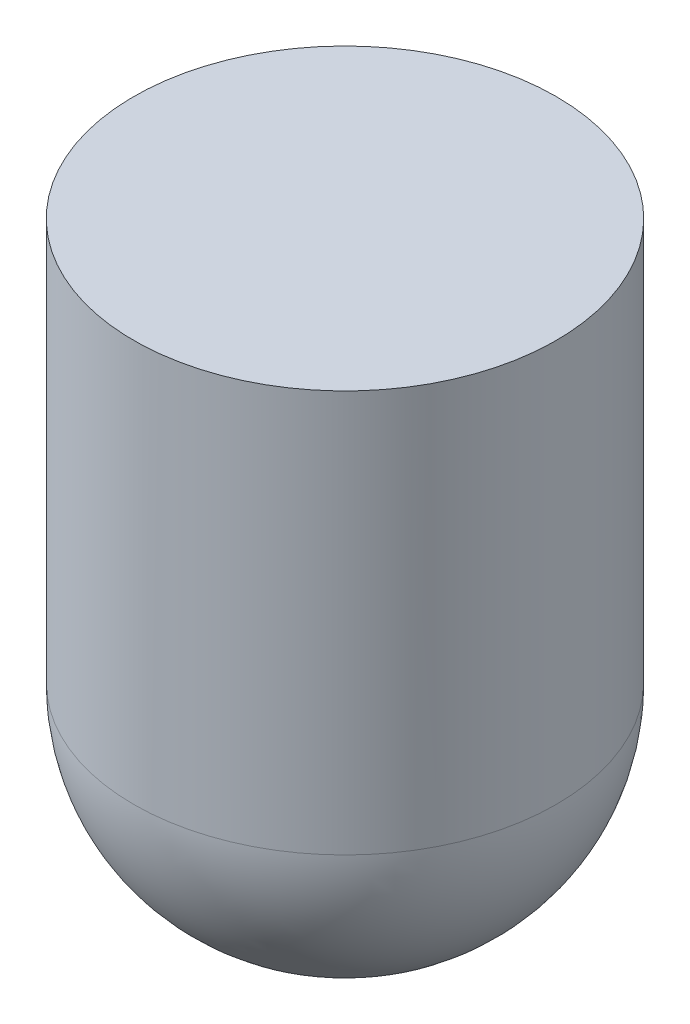
ISO-10303-21;
HEADER;
FILE_DESCRIPTION(('STEP AP214'),'2;1');
FILE_NAME('part.step','',(''),(''),'','','');
FILE_SCHEMA(('AUTOMOTIVE_DESIGN { 1 0 10303 214 1 1 1 1 }'));
ENDSEC;
DATA;
#1=APPLICATION_CONTEXT('core data for automotive mechanical design processes');
#2=APPLICATION_PROTOCOL_DEFINITION('international standard','automotive_design',2000,#1);
#3=PRODUCT_CONTEXT('',#1,'mechanical');
#4=PRODUCT('Part','Part','',(#3));
#5=PRODUCT_RELATED_PRODUCT_CATEGORY('part','',(#4));
#6=PRODUCT_DEFINITION_FORMATION('','',#4);
#7=PRODUCT_DEFINITION_CONTEXT('part definition',#1,'design');
#8=PRODUCT_DEFINITION('design','',#6,#7);
#9=PRODUCT_DEFINITION_SHAPE('','',#8);
#10=(LENGTH_UNIT() NAMED_UNIT(*) SI_UNIT(.MILLI.,.METRE.));
#11=(NAMED_UNIT(*) PLANE_ANGLE_UNIT() SI_UNIT($,.RADIAN.));
#12=(NAMED_UNIT(*) SI_UNIT($,.STERADIAN.) SOLID_ANGLE_UNIT());
#13=UNCERTAINTY_MEASURE_WITH_UNIT(LENGTH_MEASURE(1.E-05),#10,'distance_accuracy_value','');
#14=(GEOMETRIC_REPRESENTATION_CONTEXT(3) GLOBAL_UNCERTAINTY_ASSIGNED_CONTEXT((#13)) GLOBAL_UNIT_ASSIGNED_CONTEXT((#10,
#11,#12)) REPRESENTATION_CONTEXT('',''));
#15=CARTESIAN_POINT('',(0.,0.,0.));
#16=DIRECTION('',(0.,0.,1.));
#17=DIRECTION('',(1.,0.,0.));
#18=AXIS2_PLACEMENT_3D('',#15,#16,#17);
#19=CARTESIAN_POINT('',(0.,374.65,0.));
#20=DIRECTION('',(0.,-1.,0.));
#21=DIRECTION('',(0.,0.,-1.));
#22=AXIS2_PLACEMENT_3D('',#19,#20,#21);
#23=CYLINDRICAL_SURFACE('',#22,130.175);
#24=CARTESIAN_POINT('',(0.,126.999999999998,0.));
#25=DIRECTION('',(0.,1.,0.));
#26=DIRECTION('',(0.,0.,1.));
#27=AXIS2_PLACEMENT_3D('',#24,#25,#26);
#28=CIRCLE('',#27,130.175);
#29=CARTESIAN_POINT('',(0.,126.999999999998,-130.175));
#30=VERTEX_POINT('',#29);
#31=EDGE_CURVE('E45',#30,#30,#28,.T.);
#32=CARTESIAN_POINT('',(0.,374.65,0.));
#33=DIRECTION('',(0.,1.,0.));
#34=DIRECTION('',(0.,0.,1.));
#35=AXIS2_PLACEMENT_3D('',#32,#33,#34);
#36=CIRCLE('',#35,130.175);
#37=CARTESIAN_POINT('',(0.,374.65,-130.175));
#38=VERTEX_POINT('',#37);
#39=EDGE_CURVE('E50',#38,#38,#36,.T.);
#40=CARTESIAN_POINT('',(0.,126.999999999998,-130.175));
#41=CARTESIAN_POINT('',(0.,129.579687499998,-130.175));
#42=CARTESIAN_POINT('',(0.,132.159374999998,-130.175));
#43=CARTESIAN_POINT('',(0.,137.318749999998,-130.175));
#44=CARTESIAN_POINT('',(0.,139.898437499998,-130.175));
#45=CARTESIAN_POINT('',(0.,145.057812499998,-130.175));
#46=CARTESIAN_POINT('',(0.,147.637499999998,-130.175));
#47=CARTESIAN_POINT('',(0.,152.796874999998,-130.175));
#48=CARTESIAN_POINT('',(0.,155.376562499998,-130.175));
#49=CARTESIAN_POINT('',(0.,160.535937499998,-130.175));
#50=CARTESIAN_POINT('',(0.,163.115624999998,-130.175));
#51=CARTESIAN_POINT('',(0.,168.274999999998,-130.175));
#52=CARTESIAN_POINT('',(0.,170.854687499998,-130.175));
#53=CARTESIAN_POINT('',(0.,176.014062499998,-130.175));
#54=CARTESIAN_POINT('',(0.,178.593749999998,-130.175));
#55=CARTESIAN_POINT('',(0.,183.753124999998,-130.175));
#56=CARTESIAN_POINT('',(0.,186.332812499998,-130.175));
#57=CARTESIAN_POINT('',(0.,191.492187499998,-130.175));
#58=CARTESIAN_POINT('',(0.,194.071874999998,-130.175));
#59=CARTESIAN_POINT('',(0.,199.231249999998,-130.175));
#60=CARTESIAN_POINT('',(0.,201.810937499998,-130.175));
#61=CARTESIAN_POINT('',(0.,206.970312499998,-130.175));
#62=CARTESIAN_POINT('',(0.,209.549999999999,-130.175));
#63=CARTESIAN_POINT('',(0.,214.709374999999,-130.175));
#64=CARTESIAN_POINT('',(0.,217.289062499999,-130.175));
#65=CARTESIAN_POINT('',(0.,222.448437499999,-130.175));
#66=CARTESIAN_POINT('',(0.,225.028124999999,-130.175));
#67=CARTESIAN_POINT('',(0.,230.187499999999,-130.175));
#68=CARTESIAN_POINT('',(0.,232.767187499999,-130.175));
#69=CARTESIAN_POINT('',(0.,237.926562499999,-130.175));
#70=CARTESIAN_POINT('',(0.,240.506249999999,-130.175));
#71=CARTESIAN_POINT('',(0.,245.665624999999,-130.175));
#72=CARTESIAN_POINT('',(0.,248.245312499999,-130.175));
#73=CARTESIAN_POINT('',(0.,253.404687499999,-130.175));
#74=CARTESIAN_POINT('',(0.,255.984374999999,-130.175));
#75=CARTESIAN_POINT('',(0.,261.143749999999,-130.175));
#76=CARTESIAN_POINT('',(0.,263.723437499999,-130.175));
#77=CARTESIAN_POINT('',(0.,268.882812499999,-130.175));
#78=CARTESIAN_POINT('',(0.,271.462499999999,-130.175));
#79=CARTESIAN_POINT('',(0.,276.621874999999,-130.175));
#80=CARTESIAN_POINT('',(0.,279.201562499999,-130.175));
#81=CARTESIAN_POINT('',(0.,284.360937499999,-130.175));
#82=CARTESIAN_POINT('',(0.,286.940624999999,-130.175));
#83=CARTESIAN_POINT('',(0.,292.099999999999,-130.175));
#84=CARTESIAN_POINT('',(0.,294.679687499999,-130.175));
#85=CARTESIAN_POINT('',(0.,299.839062499999,-130.175));
#86=CARTESIAN_POINT('',(0.,302.418749999999,-130.175));
#87=CARTESIAN_POINT('',(0.,307.578124999999,-130.175));
#88=CARTESIAN_POINT('',(0.,310.157812499999,-130.175));
#89=CARTESIAN_POINT('',(0.,315.317187499999,-130.175));
#90=CARTESIAN_POINT('',(0.,317.896874999999,-130.175));
#91=CARTESIAN_POINT('',(0.,323.05625,-130.175));
#92=CARTESIAN_POINT('',(0.,325.635937499999,-130.175));
#93=CARTESIAN_POINT('',(0.,330.7953125,-130.175));
#94=CARTESIAN_POINT('',(0.,333.375,-130.175));
#95=CARTESIAN_POINT('',(0.,338.534375,-130.175));
#96=CARTESIAN_POINT('',(0.,341.1140625,-130.175));
#97=CARTESIAN_POINT('',(0.,346.2734375,-130.175));
#98=CARTESIAN_POINT('',(0.,348.853125,-130.175));
#99=CARTESIAN_POINT('',(0.,354.0125,-130.175));
#100=CARTESIAN_POINT('',(0.,356.5921875,-130.175));
#101=CARTESIAN_POINT('',(0.,361.7515625,-130.175));
#102=CARTESIAN_POINT('',(0.,364.33125,-130.175));
#103=CARTESIAN_POINT('',(0.,369.490625,-130.175));
#104=CARTESIAN_POINT('',(0.,372.0703125,-130.175));
#105=CARTESIAN_POINT('',(0.,374.65,-130.175));
#106=B_SPLINE_CURVE_WITH_KNOTS('',3,(#40,#41,#42,#43,#44,#45,#46,#47,#48,#49,#50,#51,#52,#53,
#54,#55,#56,#57,#58,#59,#60,#61,#62,#63,#64,#65,#66,#67,#68,#69,#70,#71,#72,#73,#74,#75,#76,#77,
#78,#79,#80,#81,#82,#83,#84,#85,#86,#87,#88,#89,#90,#91,#92,#93,#94,#95,#96,#97,#98,#99,#100,
#101,#102,#103,#104,#105),.UNSPECIFIED.,.F.,.F.,(4,2,2,2,2,2,2,2,2,2,2,2,2,2,2,2,2,2,2,2,2,2,2,
2,2,2,2,2,2,2,2,2,4),(0.,7.73906250000006,15.4781250000001,23.2171875000002,30.9562500000003,
38.6953125000004,46.4343750000004,54.1734375000005,61.9125000000006,69.6515625000006,
77.3906250000007,85.1296875000008,92.8687500000008,100.607812500001,108.346875000001,
116.085937500001,123.825000000001,131.564062500001,139.303125000001,147.042187500001,
154.781250000001,162.520312500001,170.259375000002,177.998437500002,185.737500000002,
193.476562500002,201.215625000002,208.954687500002,216.693750000002,224.432812500002,
232.171875000002,239.910937500002,247.650000000002),.UNSPECIFIED.);
#107=EDGE_CURVE('BSEAM37',#30,#38,#106,.T.);
#108=ORIENTED_EDGE('',*,*,#31,.T.);
#109=ORIENTED_EDGE('',*,*,#39,.F.);
#110=ORIENTED_EDGE('',*,*,#107,.T.);
#111=ORIENTED_EDGE('',*,*,#107,.F.);
#112=EDGE_LOOP('',(#108,#110,#109,#111));
#113=FACE_BOUND('',#112,.T.);
#114=ADVANCED_FACE('F37',(#113),#23,.T.);
#115=CARTESIAN_POINT('',(0.,374.65,0.));
#116=DIRECTION('',(0.,1.,0.));
#117=DIRECTION('',(0.,0.,1.));
#118=AXIS2_PLACEMENT_3D('',#115,#116,#117);
#119=PLANE('',#118);
#120=ORIENTED_EDGE('',*,*,#39,.T.);
#121=EDGE_LOOP('',(#120));
#122=FACE_BOUND('',#121,.T.);
#123=ADVANCED_FACE('F58',(#122),#119,.T.);
#124=CARTESIAN_POINT('',(0.,0.,0.));
#125=DIRECTION('',(0.,1.,0.));
#126=DIRECTION('',(0.,0.,1.));
#127=AXIS2_PLACEMENT_3D('',#124,#125,#126);
#128=PLANE('',#127);
#129=CARTESIAN_POINT('',(0.,0.,0.));
#130=DIRECTION('',(0.,1.,0.));
#131=DIRECTION('',(0.,0.,1.));
#132=AXIS2_PLACEMENT_3D('',#129,#130,#131);
#133=CIRCLE('',#132,3.17499999999998);
#134=CARTESIAN_POINT('',(0.,0.,3.17499999999998));
#135=VERTEX_POINT('',#134);
#136=EDGE_CURVE('E10',#135,#135,#133,.F.);
#137=ORIENTED_EDGE('',*,*,#136,.T.);
#138=EDGE_LOOP('',(#137));
#139=FACE_BOUND('',#138,.T.);
#140=ADVANCED_FACE('F64',(#139),#128,.F.);
#141=CARTESIAN_POINT('',(0.,127.,0.));
#142=DIRECTION('',(0.,1.,0.));
#143=DIRECTION('',(0.,0.,1.));
#144=AXIS2_PLACEMENT_3D('',#141,#142,#143);
#145=DEGENERATE_TOROIDAL_SURFACE('',#144,3.17499999999998,127.,.T.);
#146=ORIENTED_EDGE('',*,*,#136,.F.);
#147=EDGE_LOOP('',(#146));
#148=FACE_BOUND('',#147,.T.);
#149=ORIENTED_EDGE('',*,*,#31,.F.);
#150=EDGE_LOOP('',(#149));
#151=FACE_BOUND('',#150,.T.);
#152=ADVANCED_FACE('F39',(#148,#151),#145,.T.);
#153=CLOSED_SHELL('',(#114,#123,#140,#152));
#154=MANIFOLD_SOLID_BREP('B2',#153);
#155=ADVANCED_BREP_SHAPE_REPRESENTATION('',(#18,#154),#14);
#156=SHAPE_DEFINITION_REPRESENTATION(#9,#155);
ENDSEC;
END-ISO-10303-21;
